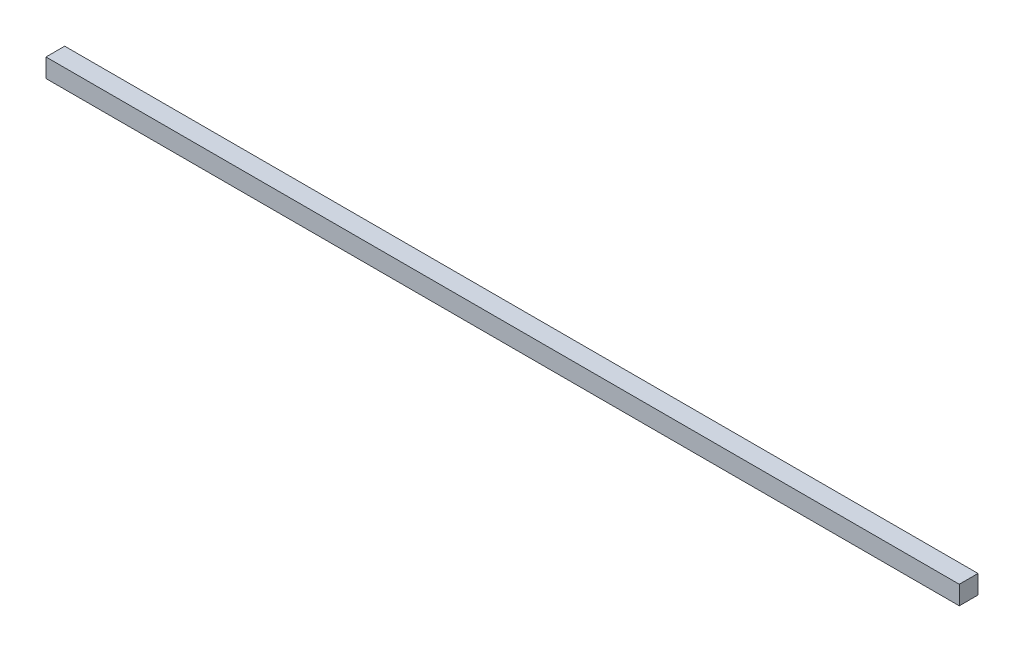
ISO-10303-21;
HEADER;
FILE_DESCRIPTION(('STEP AP214'),'2;1');
FILE_NAME('part.step','',(''),(''),'','','');
FILE_SCHEMA(('AUTOMOTIVE_DESIGN { 1 0 10303 214 1 1 1 1 }'));
ENDSEC;
DATA;
#1=APPLICATION_CONTEXT('core data for automotive mechanical design processes');
#2=APPLICATION_PROTOCOL_DEFINITION('international standard','automotive_design',2000,#1);
#3=PRODUCT_CONTEXT('',#1,'mechanical');
#4=PRODUCT('Part','Part','',(#3));
#5=PRODUCT_RELATED_PRODUCT_CATEGORY('part','',(#4));
#6=PRODUCT_DEFINITION_FORMATION('','',#4);
#7=PRODUCT_DEFINITION_CONTEXT('part definition',#1,'design');
#8=PRODUCT_DEFINITION('design','',#6,#7);
#9=PRODUCT_DEFINITION_SHAPE('','',#8);
#10=(LENGTH_UNIT() NAMED_UNIT(*) SI_UNIT(.MILLI.,.METRE.));
#11=(NAMED_UNIT(*) PLANE_ANGLE_UNIT() SI_UNIT($,.RADIAN.));
#12=(NAMED_UNIT(*) SI_UNIT($,.STERADIAN.) SOLID_ANGLE_UNIT());
#13=UNCERTAINTY_MEASURE_WITH_UNIT(LENGTH_MEASURE(1.E-05),#10,'distance_accuracy_value','');
#14=(GEOMETRIC_REPRESENTATION_CONTEXT(3) GLOBAL_UNCERTAINTY_ASSIGNED_CONTEXT((#13)) GLOBAL_UNIT_ASSIGNED_CONTEXT((#10,
#11,#12)) REPRESENTATION_CONTEXT('',''));
#15=CARTESIAN_POINT('',(0.,0.,0.));
#16=DIRECTION('',(0.,0.,1.));
#17=DIRECTION('',(1.,0.,0.));
#18=AXIS2_PLACEMENT_3D('',#15,#16,#17);
#19=CARTESIAN_POINT('',(0.,0.,50.));
#20=DIRECTION('',(1.,0.,0.));
#21=DIRECTION('',(0.,0.,-1.));
#22=AXIS2_PLACEMENT_3D('',#19,#20,#21);
#23=PLANE('',#22);
#24=DIRECTION('',(0.,-1.,0.));
#25=VECTOR('',#24,1.);
#26=CARTESIAN_POINT('',(0.,0.,0.));
#27=LINE('',#26,#25);
#28=CARTESIAN_POINT('',(0.,50.,0.));
#29=VERTEX_POINT('',#28);
#30=CARTESIAN_POINT('',(0.,0.,0.));
#31=VERTEX_POINT('',#30);
#32=EDGE_CURVE('E99',#29,#31,#27,.T.);
#33=ORIENTED_EDGE('',*,*,#32,.T.);
#34=DIRECTION('',(0.,0.,-1.));
#35=VECTOR('',#34,1.);
#36=CARTESIAN_POINT('',(0.,0.,50.));
#37=LINE('',#36,#35);
#38=CARTESIAN_POINT('',(0.,0.,50.));
#39=VERTEX_POINT('',#38);
#40=EDGE_CURVE('E11',#39,#31,#37,.T.);
#41=ORIENTED_EDGE('',*,*,#40,.F.);
#42=DIRECTION('',(0.,-1.,0.));
#43=VECTOR('',#42,1.);
#44=CARTESIAN_POINT('',(0.,0.,50.));
#45=LINE('',#44,#43);
#46=CARTESIAN_POINT('',(0.,50.,50.));
#47=VERTEX_POINT('',#46);
#48=EDGE_CURVE('E87',#47,#39,#45,.T.);
#49=ORIENTED_EDGE('',*,*,#48,.F.);
#50=DIRECTION('',(0.,0.,-1.));
#51=VECTOR('',#50,1.);
#52=CARTESIAN_POINT('',(0.,50.,50.));
#53=LINE('',#52,#51);
#54=EDGE_CURVE('E95',#47,#29,#53,.T.);
#55=ORIENTED_EDGE('',*,*,#54,.T.);
#56=EDGE_LOOP('',(#33,#41,#49,#55));
#57=FACE_BOUND('',#56,.T.);
#58=ADVANCED_FACE('F36',(#57),#23,.F.);
#59=CARTESIAN_POINT('',(0.,0.,50.));
#60=DIRECTION('',(0.,1.,0.));
#61=DIRECTION('',(0.,0.,1.));
#62=AXIS2_PLACEMENT_3D('',#59,#60,#61);
#63=PLANE('',#62);
#64=DIRECTION('',(1.,0.,0.));
#65=VECTOR('',#64,1.);
#66=CARTESIAN_POINT('',(0.,0.,0.));
#67=LINE('',#66,#65);
#68=CARTESIAN_POINT('',(2440.,0.,0.));
#69=VERTEX_POINT('',#68);
#70=EDGE_CURVE('E91',#31,#69,#67,.T.);
#71=ORIENTED_EDGE('',*,*,#70,.T.);
#72=DIRECTION('',(0.,0.,-1.));
#73=VECTOR('',#72,1.);
#74=CARTESIAN_POINT('',(2440.,0.,50.));
#75=LINE('',#74,#73);
#76=CARTESIAN_POINT('',(2440.,0.,50.));
#77=VERTEX_POINT('',#76);
#78=EDGE_CURVE('E44',#77,#69,#75,.T.);
#79=ORIENTED_EDGE('',*,*,#78,.F.);
#80=DIRECTION('',(1.,0.,0.));
#81=VECTOR('',#80,1.);
#82=CARTESIAN_POINT('',(0.,0.,50.));
#83=LINE('',#82,#81);
#84=EDGE_CURVE('E82',#39,#77,#83,.T.);
#85=ORIENTED_EDGE('',*,*,#84,.F.);
#86=ORIENTED_EDGE('',*,*,#40,.T.);
#87=EDGE_LOOP('',(#71,#79,#85,#86));
#88=FACE_BOUND('',#87,.T.);
#89=ADVANCED_FACE('F90',(#88),#63,.F.);
#90=CARTESIAN_POINT('',(2440.,0.,50.));
#91=DIRECTION('',(-1.,0.,0.));
#92=DIRECTION('',(0.,0.,1.));
#93=AXIS2_PLACEMENT_3D('',#90,#91,#92);
#94=PLANE('',#93);
#95=DIRECTION('',(0.,1.,0.));
#96=VECTOR('',#95,1.);
#97=CARTESIAN_POINT('',(2440.,0.,0.));
#98=LINE('',#97,#96);
#99=CARTESIAN_POINT('',(2440.,50.,0.));
#100=VERTEX_POINT('',#99);
#101=EDGE_CURVE('E69',#69,#100,#98,.T.);
#102=ORIENTED_EDGE('',*,*,#101,.T.);
#103=DIRECTION('',(0.,0.,-1.));
#104=VECTOR('',#103,1.);
#105=CARTESIAN_POINT('',(2440.,50.,50.));
#106=LINE('',#105,#104);
#107=CARTESIAN_POINT('',(2440.,50.,50.));
#108=VERTEX_POINT('',#107);
#109=EDGE_CURVE('E92',#108,#100,#106,.T.);
#110=ORIENTED_EDGE('',*,*,#109,.F.);
#111=DIRECTION('',(0.,1.,0.));
#112=VECTOR('',#111,1.);
#113=CARTESIAN_POINT('',(2440.,0.,50.));
#114=LINE('',#113,#112);
#115=EDGE_CURVE('E85',#77,#108,#114,.T.);
#116=ORIENTED_EDGE('',*,*,#115,.F.);
#117=ORIENTED_EDGE('',*,*,#78,.T.);
#118=EDGE_LOOP('',(#102,#110,#116,#117));
#119=FACE_BOUND('',#118,.T.);
#120=ADVANCED_FACE('F93',(#119),#94,.F.);
#121=CARTESIAN_POINT('',(0.,50.,50.));
#122=DIRECTION('',(0.,-1.,0.));
#123=DIRECTION('',(1.,0.,0.));
#124=AXIS2_PLACEMENT_3D('',#121,#122,#123);
#125=PLANE('',#124);
#126=DIRECTION('',(-1.,0.,0.));
#127=VECTOR('',#126,1.);
#128=CARTESIAN_POINT('',(0.,50.,0.));
#129=LINE('',#128,#127);
#130=EDGE_CURVE('E75',#100,#29,#129,.T.);
#131=ORIENTED_EDGE('',*,*,#130,.T.);
#132=ORIENTED_EDGE('',*,*,#54,.F.);
#133=DIRECTION('',(-1.,0.,0.));
#134=VECTOR('',#133,1.);
#135=CARTESIAN_POINT('',(0.,50.,50.));
#136=LINE('',#135,#134);
#137=EDGE_CURVE('E52',#108,#47,#136,.T.);
#138=ORIENTED_EDGE('',*,*,#137,.F.);
#139=ORIENTED_EDGE('',*,*,#109,.T.);
#140=EDGE_LOOP('',(#131,#132,#138,#139));
#141=FACE_BOUND('',#140,.T.);
#142=ADVANCED_FACE('F106',(#141),#125,.F.);
#143=CARTESIAN_POINT('',(0.,0.,50.));
#144=DIRECTION('',(0.,0.,-1.));
#145=DIRECTION('',(-1.,0.,0.));
#146=AXIS2_PLACEMENT_3D('',#143,#144,#145);
#147=PLANE('',#146);
#148=ORIENTED_EDGE('',*,*,#48,.T.);
#149=ORIENTED_EDGE('',*,*,#84,.T.);
#150=ORIENTED_EDGE('',*,*,#115,.T.);
#151=ORIENTED_EDGE('',*,*,#137,.T.);
#152=EDGE_LOOP('',(#148,#149,#150,#151));
#153=FACE_BOUND('',#152,.T.);
#154=ADVANCED_FACE('F83',(#153),#147,.F.);
#155=CARTESIAN_POINT('',(0.,0.,0.));
#156=DIRECTION('',(0.,0.,-1.));
#157=DIRECTION('',(-1.,0.,0.));
#158=AXIS2_PLACEMENT_3D('',#155,#156,#157);
#159=PLANE('',#158);
#160=ORIENTED_EDGE('',*,*,#32,.F.);
#161=ORIENTED_EDGE('',*,*,#130,.F.);
#162=ORIENTED_EDGE('',*,*,#101,.F.);
#163=ORIENTED_EDGE('',*,*,#70,.F.);
#164=EDGE_LOOP('',(#160,#161,#162,#163));
#165=FACE_BOUND('',#164,.T.);
#166=ADVANCED_FACE('F109',(#165),#159,.T.);
#167=CLOSED_SHELL('',(#58,#89,#120,#142,#154,#166));
#168=MANIFOLD_SOLID_BREP('B2',#167);
#169=ADVANCED_BREP_SHAPE_REPRESENTATION('',(#18,#168),#14);
#170=SHAPE_DEFINITION_REPRESENTATION(#9,#169);
ENDSEC;
END-ISO-10303-21;
